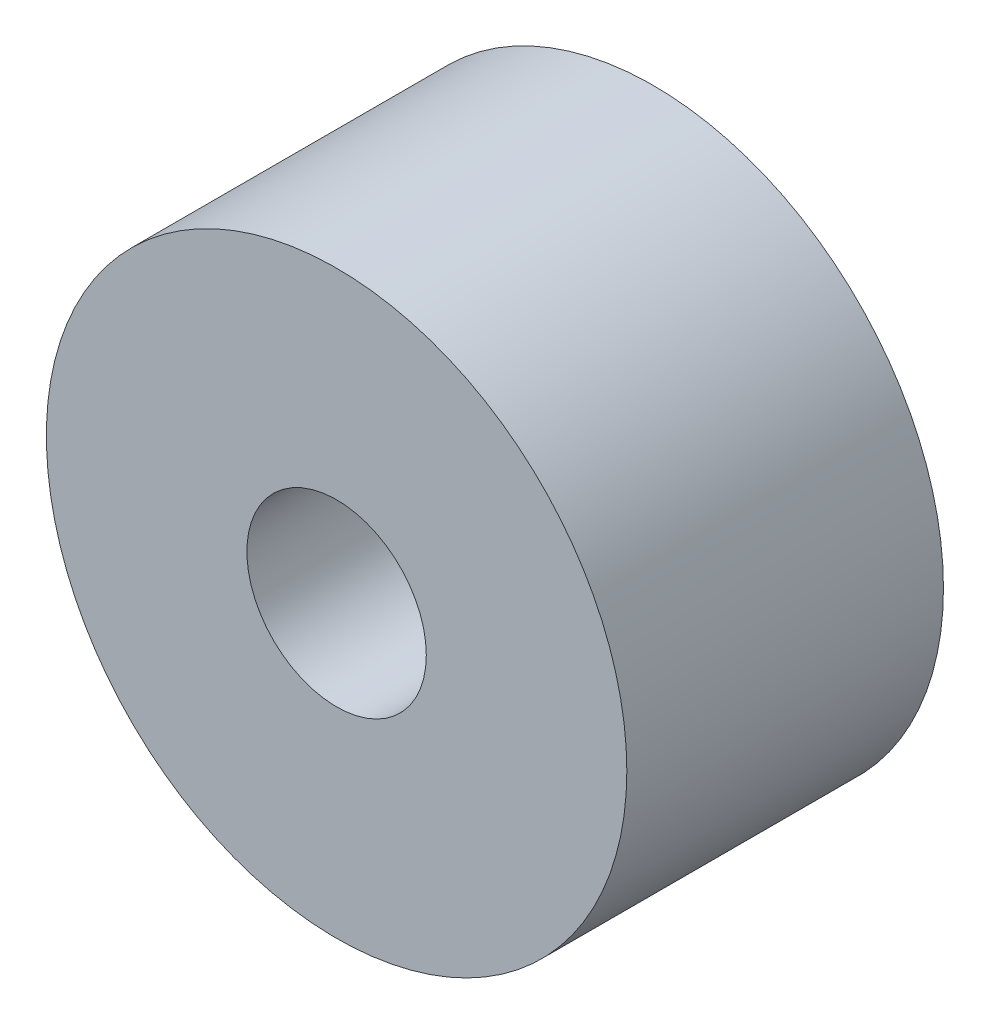
ISO-10303-21;
HEADER;
FILE_DESCRIPTION(('STEP AP214'),'2;1');
FILE_NAME('part.step','',(''),(''),'','','');
FILE_SCHEMA(('AUTOMOTIVE_DESIGN { 1 0 10303 214 1 1 1 1 }'));
ENDSEC;
DATA;
#1=APPLICATION_CONTEXT('core data for automotive mechanical design processes');
#2=APPLICATION_PROTOCOL_DEFINITION('international standard','automotive_design',2000,#1);
#3=PRODUCT_CONTEXT('',#1,'mechanical');
#4=PRODUCT('Part','Part','',(#3));
#5=PRODUCT_RELATED_PRODUCT_CATEGORY('part','',(#4));
#6=PRODUCT_DEFINITION_FORMATION('','',#4);
#7=PRODUCT_DEFINITION_CONTEXT('part definition',#1,'design');
#8=PRODUCT_DEFINITION('design','',#6,#7);
#9=PRODUCT_DEFINITION_SHAPE('','',#8);
#10=(LENGTH_UNIT() NAMED_UNIT(*) SI_UNIT(.MILLI.,.METRE.));
#11=(NAMED_UNIT(*) PLANE_ANGLE_UNIT() SI_UNIT($,.RADIAN.));
#12=(NAMED_UNIT(*) SI_UNIT($,.STERADIAN.) SOLID_ANGLE_UNIT());
#13=UNCERTAINTY_MEASURE_WITH_UNIT(LENGTH_MEASURE(1.E-05),#10,'distance_accuracy_value','');
#14=(GEOMETRIC_REPRESENTATION_CONTEXT(3) GLOBAL_UNCERTAINTY_ASSIGNED_CONTEXT((#13)) GLOBAL_UNIT_ASSIGNED_CONTEXT((#10,
#11,#12)) REPRESENTATION_CONTEXT('',''));
#15=CARTESIAN_POINT('',(0.,0.,0.));
#16=DIRECTION('',(0.,0.,1.));
#17=DIRECTION('',(1.,0.,0.));
#18=AXIS2_PLACEMENT_3D('',#15,#16,#17);
#19=CARTESIAN_POINT('',(0.,0.,6.));
#20=DIRECTION('',(0.,0.,-1.));
#21=DIRECTION('',(-1.,0.,0.));
#22=AXIS2_PLACEMENT_3D('',#19,#20,#21);
#23=CYLINDRICAL_SURFACE('',#22,5.5);
#24=CARTESIAN_POINT('',(0.,0.,6.));
#25=DIRECTION('',(0.,0.,1.));
#26=DIRECTION('',(1.,0.,0.));
#27=AXIS2_PLACEMENT_3D('',#24,#25,#26);
#28=CIRCLE('',#27,5.5);
#29=CARTESIAN_POINT('',(5.5,0.,6.));
#30=VERTEX_POINT('',#29);
#31=EDGE_CURVE('E10',#30,#30,#28,.T.);
#32=ORIENTED_EDGE('',*,*,#31,.F.);
#33=EDGE_LOOP('',(#32));
#34=FACE_BOUND('',#33,.T.);
#35=CARTESIAN_POINT('',(0.,0.,0.));
#36=DIRECTION('',(0.,0.,1.));
#37=DIRECTION('',(1.,0.,0.));
#38=AXIS2_PLACEMENT_3D('',#35,#36,#37);
#39=CIRCLE('',#38,5.5);
#40=CARTESIAN_POINT('',(5.5,0.,0.));
#41=VERTEX_POINT('',#40);
#42=EDGE_CURVE('E37',#41,#41,#39,.T.);
#43=ORIENTED_EDGE('',*,*,#42,.T.);
#44=EDGE_LOOP('',(#43));
#45=FACE_BOUND('',#44,.T.);
#46=ADVANCED_FACE('F34',(#34,#45),#23,.T.);
#47=CARTESIAN_POINT('',(0.,0.,6.));
#48=DIRECTION('',(0.,0.,1.));
#49=DIRECTION('',(1.,0.,0.));
#50=AXIS2_PLACEMENT_3D('',#47,#48,#49);
#51=PLANE('',#50);
#52=CARTESIAN_POINT('',(0.,0.,6.));
#53=DIRECTION('',(0.,0.,1.));
#54=DIRECTION('',(1.,0.,0.));
#55=AXIS2_PLACEMENT_3D('',#52,#53,#54);
#56=CIRCLE('',#55,1.69999999999999);
#57=CARTESIAN_POINT('',(1.69999999999999,0.,6.));
#58=VERTEX_POINT('',#57);
#59=EDGE_CURVE('E52',#58,#58,#56,.T.);
#60=ORIENTED_EDGE('',*,*,#59,.F.);
#61=EDGE_LOOP('',(#60));
#62=FACE_BOUND('',#61,.T.);
#63=ORIENTED_EDGE('',*,*,#31,.T.);
#64=EDGE_LOOP('',(#63));
#65=FACE_BOUND('',#64,.T.);
#66=ADVANCED_FACE('F58',(#62,#65),#51,.T.);
#67=CARTESIAN_POINT('',(0.,0.,0.));
#68=DIRECTION('',(0.,0.,1.));
#69=DIRECTION('',(1.,0.,0.));
#70=AXIS2_PLACEMENT_3D('',#67,#68,#69);
#71=PLANE('',#70);
#72=CARTESIAN_POINT('',(0.,0.,0.));
#73=DIRECTION('',(0.,0.,1.));
#74=DIRECTION('',(1.,0.,0.));
#75=AXIS2_PLACEMENT_3D('',#72,#73,#74);
#76=CIRCLE('',#75,1.69999999999999);
#77=CARTESIAN_POINT('',(1.69999999999999,0.,0.));
#78=VERTEX_POINT('',#77);
#79=EDGE_CURVE('E47',#78,#78,#76,.T.);
#80=ORIENTED_EDGE('',*,*,#79,.T.);
#81=EDGE_LOOP('',(#80));
#82=FACE_BOUND('',#81,.T.);
#83=ORIENTED_EDGE('',*,*,#42,.F.);
#84=EDGE_LOOP('',(#83));
#85=FACE_BOUND('',#84,.T.);
#86=ADVANCED_FACE('F60',(#82,#85),#71,.F.);
#87=CARTESIAN_POINT('',(0.,0.,6.));
#88=DIRECTION('',(0.,0.,1.));
#89=DIRECTION('',(1.,0.,0.));
#90=AXIS2_PLACEMENT_3D('',#87,#88,#89);
#91=CYLINDRICAL_SURFACE('',#90,1.69999999999999);
#92=ORIENTED_EDGE('',*,*,#79,.F.);
#93=EDGE_LOOP('',(#92));
#94=FACE_BOUND('',#93,.T.);
#95=ORIENTED_EDGE('',*,*,#59,.T.);
#96=EDGE_LOOP('',(#95));
#97=FACE_BOUND('',#96,.T.);
#98=ADVANCED_FACE('F56',(#94,#97),#91,.F.);
#99=CLOSED_SHELL('',(#46,#66,#86,#98));
#100=MANIFOLD_SOLID_BREP('B2',#99);
#101=ADVANCED_BREP_SHAPE_REPRESENTATION('',(#18,#100),#14);
#102=SHAPE_DEFINITION_REPRESENTATION(#9,#101);
ENDSEC;
END-ISO-10303-21;
